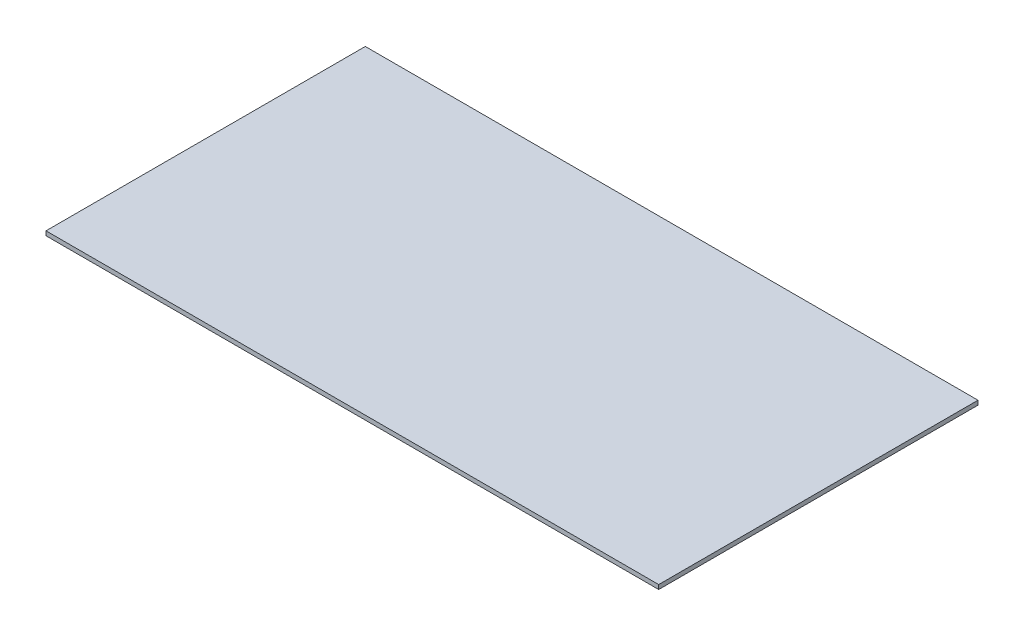
ISO-10303-21;
HEADER;
FILE_DESCRIPTION(('STEP AP214'),'2;1');
FILE_NAME('part.step','',(''),(''),'','','');
FILE_SCHEMA(('AUTOMOTIVE_DESIGN { 1 0 10303 214 1 1 1 1 }'));
ENDSEC;
DATA;
#1=APPLICATION_CONTEXT('core data for automotive mechanical design processes');
#2=APPLICATION_PROTOCOL_DEFINITION('international standard','automotive_design',2000,#1);
#3=PRODUCT_CONTEXT('',#1,'mechanical');
#4=PRODUCT('Part','Part','',(#3));
#5=PRODUCT_RELATED_PRODUCT_CATEGORY('part','',(#4));
#6=PRODUCT_DEFINITION_FORMATION('','',#4);
#7=PRODUCT_DEFINITION_CONTEXT('part definition',#1,'design');
#8=PRODUCT_DEFINITION('design','',#6,#7);
#9=PRODUCT_DEFINITION_SHAPE('','',#8);
#10=(LENGTH_UNIT() NAMED_UNIT(*) SI_UNIT(.MILLI.,.METRE.));
#11=(NAMED_UNIT(*) PLANE_ANGLE_UNIT() SI_UNIT($,.RADIAN.));
#12=(NAMED_UNIT(*) SI_UNIT($,.STERADIAN.) SOLID_ANGLE_UNIT());
#13=UNCERTAINTY_MEASURE_WITH_UNIT(LENGTH_MEASURE(1.E-05),#10,'distance_accuracy_value','');
#14=(GEOMETRIC_REPRESENTATION_CONTEXT(3) GLOBAL_UNCERTAINTY_ASSIGNED_CONTEXT((#13)) GLOBAL_UNIT_ASSIGNED_CONTEXT((#10,
#11,#12)) REPRESENTATION_CONTEXT('',''));
#15=CARTESIAN_POINT('',(0.,0.,0.));
#16=DIRECTION('',(0.,0.,1.));
#17=DIRECTION('',(1.,0.,0.));
#18=AXIS2_PLACEMENT_3D('',#15,#16,#17);
#19=CARTESIAN_POINT('',(213.,30.,0.));
#20=DIRECTION('',(-1.,0.,0.));
#21=DIRECTION('',(0.,0.,1.));
#22=AXIS2_PLACEMENT_3D('',#19,#20,#21);
#23=PLANE('',#22);
#24=DIRECTION('',(0.,0.,-1.));
#25=VECTOR('',#24,1.);
#26=CARTESIAN_POINT('',(213.,4.5,-113.));
#27=LINE('',#26,#25);
#28=CARTESIAN_POINT('',(213.,4.5,-1.99999999999999));
#29=VERTEX_POINT('',#28);
#30=CARTESIAN_POINT('',(213.,4.5,-113.));
#31=VERTEX_POINT('',#30);
#32=EDGE_CURVE('E11',#29,#31,#27,.T.);
#33=ORIENTED_EDGE('',*,*,#32,.T.);
#34=DIRECTION('',(0.,-1.,0.));
#35=VECTOR('',#34,1.);
#36=CARTESIAN_POINT('',(213.,30.,-113.));
#37=LINE('',#36,#35);
#38=CARTESIAN_POINT('',(213.,6.,-113.));
#39=VERTEX_POINT('',#38);
#40=EDGE_CURVE('E35',#39,#31,#37,.T.);
#41=ORIENTED_EDGE('',*,*,#40,.F.);
#42=DIRECTION('',(0.,0.,1.));
#43=VECTOR('',#42,1.);
#44=CARTESIAN_POINT('',(213.,6.,-113.));
#45=LINE('',#44,#43);
#46=CARTESIAN_POINT('',(213.,6.,-1.99999999999999));
#47=VERTEX_POINT('',#46);
#48=EDGE_CURVE('E26',#39,#47,#45,.T.);
#49=ORIENTED_EDGE('',*,*,#48,.T.);
#50=DIRECTION('',(0.,-1.,0.));
#51=VECTOR('',#50,1.);
#52=CARTESIAN_POINT('',(213.,30.,-2.));
#53=LINE('',#52,#51);
#54=EDGE_CURVE('E82',#47,#29,#53,.T.);
#55=ORIENTED_EDGE('',*,*,#54,.T.);
#56=EDGE_LOOP('',(#33,#41,#49,#55));
#57=FACE_BOUND('',#56,.T.);
#58=ADVANCED_FACE('F16',(#57),#23,.F.);
#59=CARTESIAN_POINT('',(215.002,6.,-1.99999999999999));
#60=DIRECTION('',(0.,0.,1.));
#61=DIRECTION('',(1.,0.,0.));
#62=AXIS2_PLACEMENT_3D('',#59,#60,#61);
#63=PLANE('',#62);
#64=ORIENTED_EDGE('',*,*,#54,.F.);
#65=DIRECTION('',(-1.,0.,0.));
#66=VECTOR('',#65,1.);
#67=CARTESIAN_POINT('',(215.002,6.,-1.99999999999999));
#68=LINE('',#67,#66);
#69=CARTESIAN_POINT('',(0.,6.,-1.99999999999999));
#70=VERTEX_POINT('',#69);
#71=EDGE_CURVE('E79',#47,#70,#68,.T.);
#72=ORIENTED_EDGE('',*,*,#71,.T.);
#73=DIRECTION('',(0.,1.,0.));
#74=VECTOR('',#73,1.);
#75=CARTESIAN_POINT('',(0.,6.,-1.99999999999999));
#76=LINE('',#75,#74);
#77=CARTESIAN_POINT('',(0.,4.5,-1.99999999999999));
#78=VERTEX_POINT('',#77);
#79=EDGE_CURVE('E74',#78,#70,#76,.T.);
#80=ORIENTED_EDGE('',*,*,#79,.F.);
#81=DIRECTION('',(-1.,0.,0.));
#82=VECTOR('',#81,1.);
#83=CARTESIAN_POINT('',(215.002,4.5,-1.99999999999999));
#84=LINE('',#83,#82);
#85=EDGE_CURVE('E72',#29,#78,#84,.T.);
#86=ORIENTED_EDGE('',*,*,#85,.F.);
#87=EDGE_LOOP('',(#64,#72,#80,#86));
#88=FACE_BOUND('',#87,.T.);
#89=ADVANCED_FACE('F90',(#88),#63,.T.);
#90=CARTESIAN_POINT('',(215.002,6.,-113.));
#91=DIRECTION('',(0.,0.,-1.));
#92=DIRECTION('',(-1.,0.,0.));
#93=AXIS2_PLACEMENT_3D('',#90,#91,#92);
#94=PLANE('',#93);
#95=DIRECTION('',(-1.,0.,0.));
#96=VECTOR('',#95,1.);
#97=CARTESIAN_POINT('',(215.002,6.,-113.));
#98=LINE('',#97,#96);
#99=CARTESIAN_POINT('',(0.,6.,-113.));
#100=VERTEX_POINT('',#99);
#101=EDGE_CURVE('E53',#39,#100,#98,.T.);
#102=ORIENTED_EDGE('',*,*,#101,.F.);
#103=ORIENTED_EDGE('',*,*,#40,.T.);
#104=DIRECTION('',(-1.,0.,0.));
#105=VECTOR('',#104,1.);
#106=CARTESIAN_POINT('',(215.002,4.5,-113.));
#107=LINE('',#106,#105);
#108=CARTESIAN_POINT('',(0.,4.5,-113.));
#109=VERTEX_POINT('',#108);
#110=EDGE_CURVE('E63',#31,#109,#107,.T.);
#111=ORIENTED_EDGE('',*,*,#110,.T.);
#112=DIRECTION('',(0.,-1.,0.));
#113=VECTOR('',#112,1.);
#114=CARTESIAN_POINT('',(0.,6.,-113.));
#115=LINE('',#114,#113);
#116=EDGE_CURVE('E59',#100,#109,#115,.T.);
#117=ORIENTED_EDGE('',*,*,#116,.F.);
#118=EDGE_LOOP('',(#102,#103,#111,#117));
#119=FACE_BOUND('',#118,.T.);
#120=ADVANCED_FACE('F66',(#119),#94,.T.);
#121=CARTESIAN_POINT('',(0.,0.,0.));
#122=DIRECTION('',(-1.,0.,0.));
#123=DIRECTION('',(0.,0.,1.));
#124=AXIS2_PLACEMENT_3D('',#121,#122,#123);
#125=PLANE('',#124);
#126=ORIENTED_EDGE('',*,*,#116,.T.);
#127=DIRECTION('',(0.,0.,1.));
#128=VECTOR('',#127,1.);
#129=CARTESIAN_POINT('',(0.,4.5,-113.));
#130=LINE('',#129,#128);
#131=EDGE_CURVE('E62',#109,#78,#130,.T.);
#132=ORIENTED_EDGE('',*,*,#131,.T.);
#133=ORIENTED_EDGE('',*,*,#79,.T.);
#134=DIRECTION('',(0.,0.,-1.));
#135=VECTOR('',#134,1.);
#136=CARTESIAN_POINT('',(0.,6.,-113.));
#137=LINE('',#136,#135);
#138=EDGE_CURVE('E20',#70,#100,#137,.T.);
#139=ORIENTED_EDGE('',*,*,#138,.T.);
#140=EDGE_LOOP('',(#126,#132,#133,#139));
#141=FACE_BOUND('',#140,.T.);
#142=ADVANCED_FACE('F60',(#141),#125,.T.);
#143=CARTESIAN_POINT('',(215.002,4.5,-113.));
#144=DIRECTION('',(0.,-1.,0.));
#145=DIRECTION('',(0.,0.,-1.));
#146=AXIS2_PLACEMENT_3D('',#143,#144,#145);
#147=PLANE('',#146);
#148=ORIENTED_EDGE('',*,*,#32,.F.);
#149=ORIENTED_EDGE('',*,*,#85,.T.);
#150=ORIENTED_EDGE('',*,*,#131,.F.);
#151=ORIENTED_EDGE('',*,*,#110,.F.);
#152=EDGE_LOOP('',(#148,#149,#150,#151));
#153=FACE_BOUND('',#152,.T.);
#154=ADVANCED_FACE('F70',(#153),#147,.T.);
#155=CARTESIAN_POINT('',(215.002,6.,-113.));
#156=DIRECTION('',(0.,1.,0.));
#157=DIRECTION('',(0.,0.,1.));
#158=AXIS2_PLACEMENT_3D('',#155,#156,#157);
#159=PLANE('',#158);
#160=ORIENTED_EDGE('',*,*,#101,.T.);
#161=ORIENTED_EDGE('',*,*,#138,.F.);
#162=ORIENTED_EDGE('',*,*,#71,.F.);
#163=ORIENTED_EDGE('',*,*,#48,.F.);
#164=EDGE_LOOP('',(#160,#161,#162,#163));
#165=FACE_BOUND('',#164,.T.);
#166=ADVANCED_FACE('F18',(#165),#159,.T.);
#167=CLOSED_SHELL('',(#58,#89,#120,#142,#154,#166));
#168=MANIFOLD_SOLID_BREP('B1',#167);
#169=ADVANCED_BREP_SHAPE_REPRESENTATION('',(#18,#168),#14);
#170=SHAPE_DEFINITION_REPRESENTATION(#9,#169);
ENDSEC;
END-ISO-10303-21;
